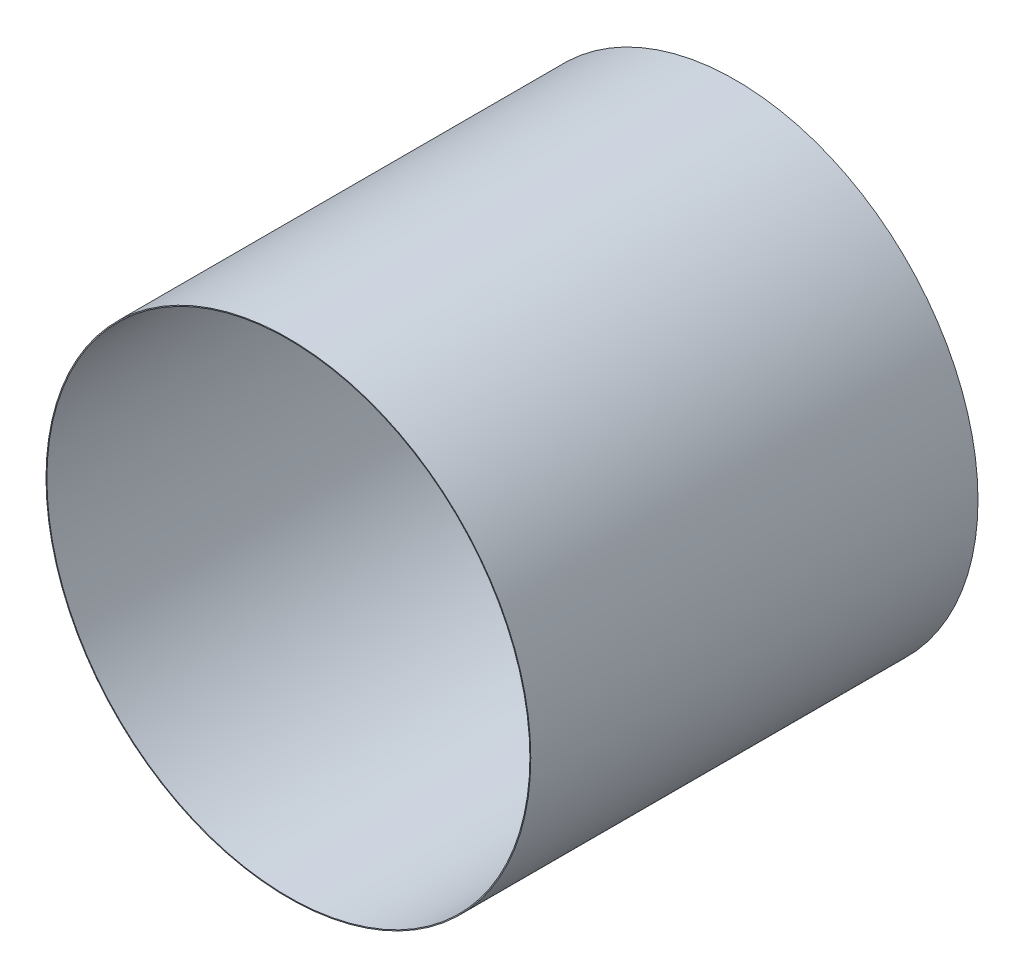
ISO-10303-21;
HEADER;
FILE_DESCRIPTION(('STEP AP214'),'2;1');
FILE_NAME('part.step','',(''),(''),'','','');
FILE_SCHEMA(('AUTOMOTIVE_DESIGN { 1 0 10303 214 1 1 1 1 }'));
ENDSEC;
DATA;
#1=APPLICATION_CONTEXT('core data for automotive mechanical design processes');
#2=APPLICATION_PROTOCOL_DEFINITION('international standard','automotive_design',2000,#1);
#3=PRODUCT_CONTEXT('',#1,'mechanical');
#4=PRODUCT('Part','Part','',(#3));
#5=PRODUCT_RELATED_PRODUCT_CATEGORY('part','',(#4));
#6=PRODUCT_DEFINITION_FORMATION('','',#4);
#7=PRODUCT_DEFINITION_CONTEXT('part definition',#1,'design');
#8=PRODUCT_DEFINITION('design','',#6,#7);
#9=PRODUCT_DEFINITION_SHAPE('','',#8);
#10=(LENGTH_UNIT() NAMED_UNIT(*) SI_UNIT(.MILLI.,.METRE.));
#11=(NAMED_UNIT(*) PLANE_ANGLE_UNIT() SI_UNIT($,.RADIAN.));
#12=(NAMED_UNIT(*) SI_UNIT($,.STERADIAN.) SOLID_ANGLE_UNIT());
#13=UNCERTAINTY_MEASURE_WITH_UNIT(LENGTH_MEASURE(1.E-05),#10,'distance_accuracy_value','');
#14=(GEOMETRIC_REPRESENTATION_CONTEXT(3) GLOBAL_UNCERTAINTY_ASSIGNED_CONTEXT((#13)) GLOBAL_UNIT_ASSIGNED_CONTEXT((#10,
#11,#12)) REPRESENTATION_CONTEXT('',''));
#15=CARTESIAN_POINT('',(0.,0.,0.));
#16=DIRECTION('',(0.,0.,1.));
#17=DIRECTION('',(1.,0.,0.));
#18=AXIS2_PLACEMENT_3D('',#15,#16,#17);
#19=CARTESIAN_POINT('',(0.,0.,25.));
#20=DIRECTION('',(0.,0.,1.));
#21=DIRECTION('',(1.,0.,0.));
#22=AXIS2_PLACEMENT_3D('',#19,#20,#21);
#23=PLANE('',#22);
#24=CARTESIAN_POINT('',(0.,0.,25.));
#25=DIRECTION('',(0.,0.,1.));
#26=DIRECTION('',(1.,0.,0.));
#27=AXIS2_PLACEMENT_3D('',#24,#25,#26);
#28=CIRCLE('',#27,13.55);
#29=CARTESIAN_POINT('',(13.55,0.,25.));
#30=VERTEX_POINT('',#29);
#31=EDGE_CURVE('E10',#30,#30,#28,.T.);
#32=ORIENTED_EDGE('',*,*,#31,.T.);
#33=EDGE_LOOP('',(#32));
#34=FACE_BOUND('',#33,.T.);
#35=CARTESIAN_POINT('',(0.,0.,25.));
#36=DIRECTION('',(0.,0.,1.));
#37=DIRECTION('',(1.,0.,0.));
#38=AXIS2_PLACEMENT_3D('',#35,#36,#37);
#39=CIRCLE('',#38,13.5);
#40=CARTESIAN_POINT('',(13.5,0.,25.));
#41=VERTEX_POINT('',#40);
#42=EDGE_CURVE('E42',#41,#41,#39,.T.);
#43=ORIENTED_EDGE('',*,*,#42,.F.);
#44=EDGE_LOOP('',(#43));
#45=FACE_BOUND('',#44,.T.);
#46=ADVANCED_FACE('F31',(#34,#45),#23,.T.);
#47=CARTESIAN_POINT('',(0.,0.,0.));
#48=DIRECTION('',(0.,0.,1.));
#49=DIRECTION('',(1.,0.,0.));
#50=AXIS2_PLACEMENT_3D('',#47,#48,#49);
#51=PLANE('',#50);
#52=CARTESIAN_POINT('',(0.,0.,0.));
#53=DIRECTION('',(0.,0.,1.));
#54=DIRECTION('',(1.,0.,0.));
#55=AXIS2_PLACEMENT_3D('',#52,#53,#54);
#56=CIRCLE('',#55,13.55);
#57=CARTESIAN_POINT('',(13.55,0.,0.));
#58=VERTEX_POINT('',#57);
#59=EDGE_CURVE('E35',#58,#58,#56,.T.);
#60=ORIENTED_EDGE('',*,*,#59,.F.);
#61=EDGE_LOOP('',(#60));
#62=FACE_BOUND('',#61,.T.);
#63=CARTESIAN_POINT('',(0.,0.,0.));
#64=DIRECTION('',(0.,0.,1.));
#65=DIRECTION('',(1.,0.,0.));
#66=AXIS2_PLACEMENT_3D('',#63,#64,#65);
#67=CIRCLE('',#66,13.5);
#68=CARTESIAN_POINT('',(13.5,0.,0.));
#69=VERTEX_POINT('',#68);
#70=EDGE_CURVE('E44',#69,#69,#67,.T.);
#71=ORIENTED_EDGE('',*,*,#70,.T.);
#72=EDGE_LOOP('',(#71));
#73=FACE_BOUND('',#72,.T.);
#74=ADVANCED_FACE('F54',(#62,#73),#51,.F.);
#75=CARTESIAN_POINT('',(0.,0.,25.));
#76=DIRECTION('',(0.,0.,-1.));
#77=DIRECTION('',(-1.,0.,0.));
#78=AXIS2_PLACEMENT_3D('',#75,#76,#77);
#79=CYLINDRICAL_SURFACE('',#78,13.55);
#80=ORIENTED_EDGE('',*,*,#31,.F.);
#81=EDGE_LOOP('',(#80));
#82=FACE_BOUND('',#81,.T.);
#83=ORIENTED_EDGE('',*,*,#59,.T.);
#84=EDGE_LOOP('',(#83));
#85=FACE_BOUND('',#84,.T.);
#86=ADVANCED_FACE('F33',(#82,#85),#79,.T.);
#87=CARTESIAN_POINT('',(0.,0.,25.));
#88=DIRECTION('',(0.,0.,-1.));
#89=DIRECTION('',(-1.,0.,0.));
#90=AXIS2_PLACEMENT_3D('',#87,#88,#89);
#91=CYLINDRICAL_SURFACE('',#90,13.5);
#92=ORIENTED_EDGE('',*,*,#42,.T.);
#93=EDGE_LOOP('',(#92));
#94=FACE_BOUND('',#93,.T.);
#95=ORIENTED_EDGE('',*,*,#70,.F.);
#96=EDGE_LOOP('',(#95));
#97=FACE_BOUND('',#96,.T.);
#98=ADVANCED_FACE('F50',(#94,#97),#91,.F.);
#99=CLOSED_SHELL('',(#46,#74,#86,#98));
#100=MANIFOLD_SOLID_BREP('B2',#99);
#101=ADVANCED_BREP_SHAPE_REPRESENTATION('',(#18,#100),#14);
#102=SHAPE_DEFINITION_REPRESENTATION(#9,#101);
ENDSEC;
END-ISO-10303-21;
